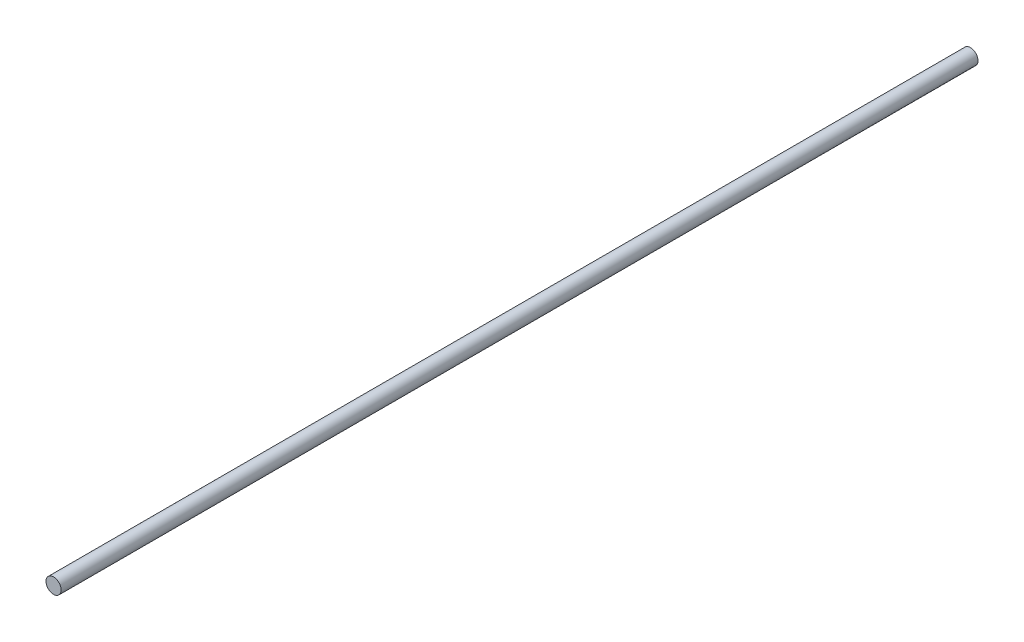
ISO-10303-21;
HEADER;
FILE_DESCRIPTION(('STEP AP214'),'2;1');
FILE_NAME('part.step','',(''),(''),'','','');
FILE_SCHEMA(('AUTOMOTIVE_DESIGN { 1 0 10303 214 1 1 1 1 }'));
ENDSEC;
DATA;
#1=APPLICATION_CONTEXT('core data for automotive mechanical design processes');
#2=APPLICATION_PROTOCOL_DEFINITION('international standard','automotive_design',2000,#1);
#3=PRODUCT_CONTEXT('',#1,'mechanical');
#4=PRODUCT('Part','Part','',(#3));
#5=PRODUCT_RELATED_PRODUCT_CATEGORY('part','',(#4));
#6=PRODUCT_DEFINITION_FORMATION('','',#4);
#7=PRODUCT_DEFINITION_CONTEXT('part definition',#1,'design');
#8=PRODUCT_DEFINITION('design','',#6,#7);
#9=PRODUCT_DEFINITION_SHAPE('','',#8);
#10=(LENGTH_UNIT() NAMED_UNIT(*) SI_UNIT(.MILLI.,.METRE.));
#11=(NAMED_UNIT(*) PLANE_ANGLE_UNIT() SI_UNIT($,.RADIAN.));
#12=(NAMED_UNIT(*) SI_UNIT($,.STERADIAN.) SOLID_ANGLE_UNIT());
#13=UNCERTAINTY_MEASURE_WITH_UNIT(LENGTH_MEASURE(1.E-05),#10,'distance_accuracy_value','');
#14=(GEOMETRIC_REPRESENTATION_CONTEXT(3) GLOBAL_UNCERTAINTY_ASSIGNED_CONTEXT((#13)) GLOBAL_UNIT_ASSIGNED_CONTEXT((#10,
#11,#12)) REPRESENTATION_CONTEXT('',''));
#15=CARTESIAN_POINT('',(0.,0.,0.));
#16=DIRECTION('',(0.,0.,1.));
#17=DIRECTION('',(1.,0.,0.));
#18=AXIS2_PLACEMENT_3D('',#15,#16,#17);
#19=CARTESIAN_POINT('',(-9.71428571428573,12.0214285714286,484.));
#20=DIRECTION('',(0.,0.,-1.));
#21=DIRECTION('',(-1.,0.,0.));
#22=AXIS2_PLACEMENT_3D('',#19,#20,#21);
#23=CYLINDRICAL_SURFACE('',#22,4.);
#24=CARTESIAN_POINT('',(-9.71428571428573,12.0214285714286,484.));
#25=DIRECTION('',(0.,0.,1.));
#26=DIRECTION('',(1.,0.,0.));
#27=AXIS2_PLACEMENT_3D('',#24,#25,#26);
#28=CIRCLE('',#27,4.);
#29=CARTESIAN_POINT('',(-5.71428571428573,12.0214285714286,484.));
#30=VERTEX_POINT('',#29);
#31=EDGE_CURVE('E10',#30,#30,#28,.T.);
#32=ORIENTED_EDGE('',*,*,#31,.F.);
#33=EDGE_LOOP('',(#32));
#34=FACE_BOUND('',#33,.T.);
#35=CARTESIAN_POINT('',(-9.71428571428573,12.0214285714286,0.));
#36=DIRECTION('',(0.,0.,1.));
#37=DIRECTION('',(1.,0.,0.));
#38=AXIS2_PLACEMENT_3D('',#35,#36,#37);
#39=CIRCLE('',#38,4.);
#40=CARTESIAN_POINT('',(-5.71428571428573,12.0214285714286,0.));
#41=VERTEX_POINT('',#40);
#42=EDGE_CURVE('E38',#41,#41,#39,.T.);
#43=ORIENTED_EDGE('',*,*,#42,.T.);
#44=EDGE_LOOP('',(#43));
#45=FACE_BOUND('',#44,.T.);
#46=ADVANCED_FACE('F35',(#34,#45),#23,.T.);
#47=CARTESIAN_POINT('',(-9.71428571428573,12.0214285714286,484.));
#48=DIRECTION('',(0.,0.,1.));
#49=DIRECTION('',(1.,0.,0.));
#50=AXIS2_PLACEMENT_3D('',#47,#48,#49);
#51=PLANE('',#50);
#52=ORIENTED_EDGE('',*,*,#31,.T.);
#53=EDGE_LOOP('',(#52));
#54=FACE_BOUND('',#53,.T.);
#55=ADVANCED_FACE('F50',(#54),#51,.T.);
#56=CARTESIAN_POINT('',(-9.71428571428573,12.0214285714286,0.));
#57=DIRECTION('',(0.,0.,1.));
#58=DIRECTION('',(1.,0.,0.));
#59=AXIS2_PLACEMENT_3D('',#56,#57,#58);
#60=PLANE('',#59);
#61=ORIENTED_EDGE('',*,*,#42,.F.);
#62=EDGE_LOOP('',(#61));
#63=FACE_BOUND('',#62,.T.);
#64=ADVANCED_FACE('F48',(#63),#60,.F.);
#65=CLOSED_SHELL('',(#46,#55,#64));
#66=MANIFOLD_SOLID_BREP('B2',#65);
#67=ADVANCED_BREP_SHAPE_REPRESENTATION('',(#18,#66),#14);
#68=SHAPE_DEFINITION_REPRESENTATION(#9,#67);
ENDSEC;
END-ISO-10303-21;
